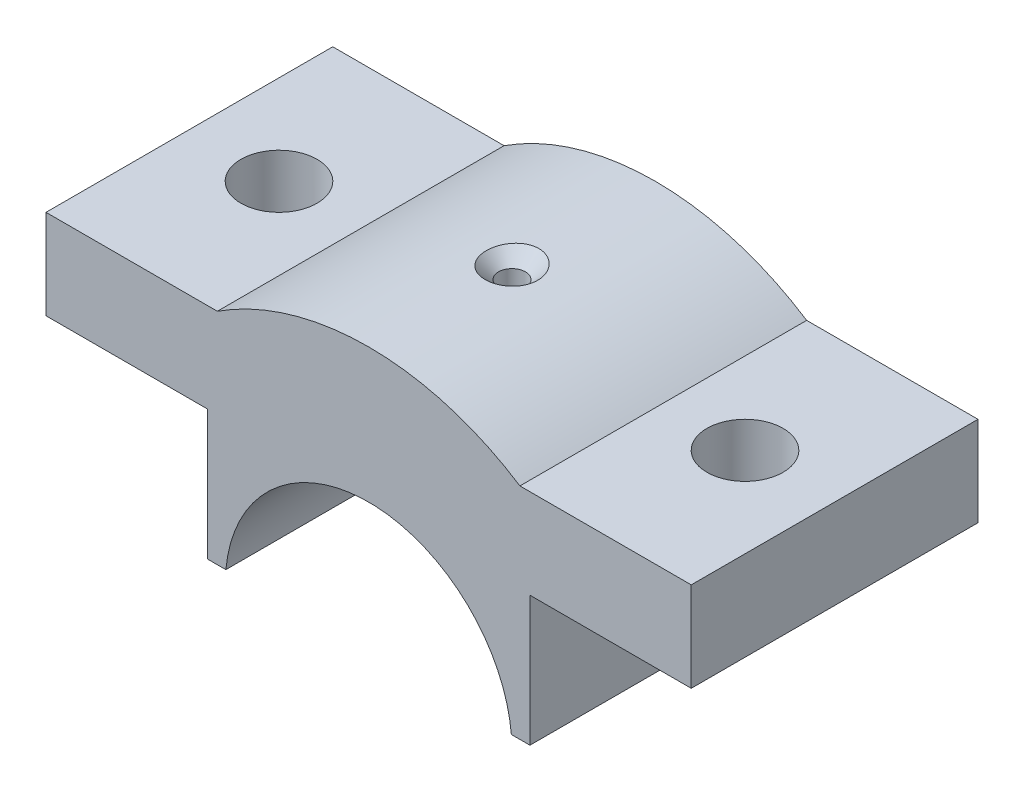
ISO-10303-21;
HEADER;
FILE_DESCRIPTION(('STEP AP214'),'2;1');
FILE_NAME('part.step','',(''),(''),'','','');
FILE_SCHEMA(('AUTOMOTIVE_DESIGN { 1 0 10303 214 1 1 1 1 }'));
ENDSEC;
DATA;
#1=APPLICATION_CONTEXT('core data for automotive mechanical design processes');
#2=APPLICATION_PROTOCOL_DEFINITION('international standard','automotive_design',2000,#1);
#3=PRODUCT_CONTEXT('',#1,'mechanical');
#4=PRODUCT('Part','Part','',(#3));
#5=PRODUCT_RELATED_PRODUCT_CATEGORY('part','',(#4));
#6=PRODUCT_DEFINITION_FORMATION('','',#4);
#7=PRODUCT_DEFINITION_CONTEXT('part definition',#1,'design');
#8=PRODUCT_DEFINITION('design','',#6,#7);
#9=PRODUCT_DEFINITION_SHAPE('','',#8);
#10=(LENGTH_UNIT() NAMED_UNIT(*) SI_UNIT(.MILLI.,.METRE.));
#11=(NAMED_UNIT(*) PLANE_ANGLE_UNIT() SI_UNIT($,.RADIAN.));
#12=(NAMED_UNIT(*) SI_UNIT($,.STERADIAN.) SOLID_ANGLE_UNIT());
#13=UNCERTAINTY_MEASURE_WITH_UNIT(LENGTH_MEASURE(1.E-05),#10,'distance_accuracy_value','');
#14=(GEOMETRIC_REPRESENTATION_CONTEXT(3) GLOBAL_UNCERTAINTY_ASSIGNED_CONTEXT((#13)) GLOBAL_UNIT_ASSIGNED_CONTEXT((#10,
#11,#12)) REPRESENTATION_CONTEXT('',''));
#15=CARTESIAN_POINT('',(0.,0.,0.));
#16=DIRECTION('',(0.,0.,1.));
#17=DIRECTION('',(1.,0.,0.));
#18=AXIS2_PLACEMENT_3D('',#15,#16,#17);
#19=CARTESIAN_POINT('',(0.,2.99999999999999,32.));
#20=DIRECTION('',(0.,1.,0.));
#21=DIRECTION('',(0.,0.,1.));
#22=AXIS2_PLACEMENT_3D('',#19,#20,#21);
#23=CYLINDRICAL_SURFACE('',#22,3.);
#24=CARTESIAN_POINT('',(0.,32.0048001568105,35.));
#25=CARTESIAN_POINT('',(0.168115517663945,32.0047983319346,34.9999926939908));
#26=CARTESIAN_POINT('',(0.336343494801439,32.0034614419944,34.985821025816));
#27=CARTESIAN_POINT('',(0.668139248437377,31.9982568701246,34.9294992968175));
#28=CARTESIAN_POINT('',(0.831701620944194,31.9943863686652,34.8873180647939));
#29=CARTESIAN_POINT('',(1.14931312039009,31.984551672751,34.7762126906234));
#30=CARTESIAN_POINT('',(1.3033677874041,31.9785887113646,34.7073042960471));
#31=CARTESIAN_POINT('',(1.5976893799492,31.9652366325189,34.5447302916791));
#32=CARTESIAN_POINT('',(1.73795912134394,31.9578478072402,34.4510697525192));
#33=CARTESIAN_POINT('',(2.00121039990366,31.9424459629027,34.2413295812445));
#34=CARTESIAN_POINT('',(2.12414194780613,31.9344312384766,34.125187325561));
#35=CARTESIAN_POINT('',(2.348797878852,31.9186950878854,33.8739137368302));
#36=CARTESIAN_POINT('',(2.45052130105543,31.9109736750232,33.7387815438133));
#37=CARTESIAN_POINT('',(2.63004768290318,31.8966806561919,33.4530547446494));
#38=CARTESIAN_POINT('',(2.70780587421977,31.8901112119074,33.3024318924965));
#39=CARTESIAN_POINT('',(2.83690863228271,31.8788865329611,32.9901956484371));
#40=CARTESIAN_POINT('',(2.88825377743868,31.8742312563822,32.8285824972908));
#41=CARTESIAN_POINT('',(2.96292588300417,31.8673770447499,32.4994599836979));
#42=CARTESIAN_POINT('',(2.9863352440661,31.8651708870142,32.3319694694281));
#43=CARTESIAN_POINT('',(3.00472593050557,31.8634421401491,31.9954232650604));
#44=CARTESIAN_POINT('',(2.99970791810621,31.8639194885067,31.8263676115145));
#45=CARTESIAN_POINT('',(2.96145428763413,31.8674972345695,31.4920566874133));
#46=CARTESIAN_POINT('',(2.92830847307408,31.8705892842186,31.3267910391936));
#47=CARTESIAN_POINT('',(2.83487977412146,31.8790349780355,31.0041789348896));
#48=CARTESIAN_POINT('',(2.77459656329884,31.8843886494078,30.84683257409));
#49=CARTESIAN_POINT('',(2.62850460075802,31.8967639746142,30.5442408492119));
#50=CARTESIAN_POINT('',(2.54265582854978,31.9037882401094,30.3990149182643));
#51=CARTESIAN_POINT('',(2.34789846752403,31.9187110137587,30.1249990810111));
#52=CARTESIAN_POINT('',(2.23898928622894,31.9266095443724,29.9962095971338));
#53=CARTESIAN_POINT('',(2.00070022736516,31.9424280645309,29.7582005446516));
#54=CARTESIAN_POINT('',(1.87124276160559,31.9503480188309,29.6490586380951));
#55=CARTESIAN_POINT('',(1.59580187450345,31.9652880478907,29.4540442329845));
#56=CARTESIAN_POINT('',(1.44981843786998,31.9723081218179,29.3681717559609));
#57=CARTESIAN_POINT('',(1.14541705514495,31.9846593253484,29.2221376118398));
#58=CARTESIAN_POINT('',(0.986997303495879,31.98999020914,29.1619796862928));
#59=CARTESIAN_POINT('',(0.662244741083313,31.9983597695283,29.0691382141594));
#60=CARTESIAN_POINT('',(0.495912138294615,32.0013985063345,29.0364539458993));
#61=CARTESIAN_POINT('',(0.160728240835851,32.0048336602874,28.9995856404269));
#62=CARTESIAN_POINT('',(-0.00811116390025835,32.0052400168862,28.9952943943303));
#63=CARTESIAN_POINT('',(-0.344106849833346,32.0033912353161,29.0150526548875));
#64=CARTESIAN_POINT('',(-0.511263150942916,32.0011361286721,29.039101825851));
#65=CARTESIAN_POINT('',(-0.838839728289025,31.9942242855993,29.1147693435582));
#66=CARTESIAN_POINT('',(-0.999271653193735,31.9895719051136,29.1663376928835));
#67=CARTESIAN_POINT('',(-1.30920699417556,31.9783877203985,29.2955284756984));
#68=CARTESIAN_POINT('',(-1.4587101935324,31.9718558789115,29.3731514256887));
#69=CARTESIAN_POINT('',(-1.743030220706,31.9576192556579,29.552515261775));
#70=CARTESIAN_POINT('',(-1.87780229220848,31.9499110610555,29.6543268185227));
#71=CARTESIAN_POINT('',(-2.12838183348266,31.9341982391321,29.8790761825181));
#72=CARTESIAN_POINT('',(-2.24418888567343,31.9261936052887,30.002014454822));
#73=CARTESIAN_POINT('',(-2.45392151261387,31.91076035801,30.2659942589946));
#74=CARTESIAN_POINT('',(-2.54777688418517,31.9033336419957,30.4070916939287));
#75=CARTESIAN_POINT('',(-2.71045983080749,31.8899252416078,30.7031078546338));
#76=CARTESIAN_POINT('',(-2.77928771188468,31.8839435395654,30.8580264113768));
#77=CARTESIAN_POINT('',(-2.88984355969819,31.8741138561404,31.1770433869726));
#78=CARTESIAN_POINT('',(-2.93161377453464,31.8702625497177,31.3411270580022));
#79=CARTESIAN_POINT('',(-2.98700585804465,31.8651190997703,31.6740167875639));
#80=CARTESIAN_POINT('',(-3.00062842757631,31.8638268925257,31.8428227284085));
#81=CARTESIAN_POINT('',(-2.9993294563224,31.8639491373506,32.1796675019656));
#82=CARTESIAN_POINT('',(-2.98451820308444,31.8653531315492,32.3477067747062));
#83=CARTESIAN_POINT('',(-2.9270027616158,31.8706873183879,32.678899227571));
#84=CARTESIAN_POINT('',(-2.88429853720601,31.8746175143046,32.8420524013573));
#85=CARTESIAN_POINT('',(-2.77223884072984,31.8845584308578,33.1588436209492));
#86=CARTESIAN_POINT('',(-2.70288612389382,31.8905689364013,33.3124826485314));
#87=CARTESIAN_POINT('',(-2.53950979661607,31.9039936639257,33.6059561486016));
#88=CARTESIAN_POINT('',(-2.44548642274569,31.911407872446,33.745790753445));
#89=CARTESIAN_POINT('',(-2.2350231729517,31.9268389875304,34.0082511111749));
#90=CARTESIAN_POINT('',(-2.11850125609184,31.9348580323374,34.1308109518064));
#91=CARTESIAN_POINT('',(-1.8665067362214,31.9505757033337,34.3546891653375));
#92=CARTESIAN_POINT('',(-1.73102958290196,31.9582742520086,34.456002423242));
#93=CARTESIAN_POINT('',(-1.44464228122472,31.9725011269799,34.6346859786519));
#94=CARTESIAN_POINT('',(-1.29369803748515,31.9790267766691,34.7120017977791));
#95=CARTESIAN_POINT('',(-0.981007628996828,31.9901427245557,34.8400891810584));
#96=CARTESIAN_POINT('',(-0.819273975005217,31.9947352206421,34.8908909061277));
#97=CARTESIAN_POINT('',(-0.547174299541794,32.0003035023116,34.9517327403566));
#98=CARTESIAN_POINT('',(-0.438552002040391,32.0019819589622,34.9698085005286));
#99=CARTESIAN_POINT('',(-0.219969184624212,32.0042308813294,34.9939444996144));
#100=CARTESIAN_POINT('',(-0.110008669417268,32.0048013509429,35.0000047807862));
#101=CARTESIAN_POINT('',(0.,32.0048001568105,35.));
#102=B_SPLINE_CURVE_WITH_KNOTS('',3,(#24,#25,#26,#27,#28,#29,#30,#31,#32,#33,#34,#35,#36,#37,
#38,#39,#40,#41,#42,#43,#44,#45,#46,#47,#48,#49,#50,#51,#52,#53,#54,#55,#56,#57,#58,#59,#60,#61,
#62,#63,#64,#65,#66,#67,#68,#69,#70,#71,#72,#73,#74,#75,#76,#77,#78,#79,#80,#81,#82,#83,#84,#85,
#86,#87,#88,#89,#90,#91,#92,#93,#94,#95,#96,#97,#98,#99,#100,#101),.UNSPECIFIED.,.T.,.F.,(4,2,2,
2,2,2,2,2,2,2,2,2,2,2,2,2,2,2,2,2,2,2,2,2,2,2,2,2,2,2,2,2,2,2,2,2,2,2,4),(0.,0.503944865997051,
1.00845150268335,1.51266133589671,2.01676795852594,2.52229953677205,3.02785401567332,
3.53434725183142,4.04082939600767,4.54581387551178,5.05078659131899,5.55415312239402,
6.05752570852099,6.56169045684706,7.06586815995459,7.57199697216073,8.07812625267417,
8.584329151591,9.0905187532349,9.5947959432735,10.0990671602439,10.6024253104018,
11.1057934396133,11.6106507227919,12.1155191206673,12.6219806991962,13.1284360847067,
13.6340987675239,14.1397488595171,14.6434416257731,15.1471350453547,15.6507764012726,
16.1544129278599,16.6599218849808,17.1655524011808,17.6723225302686,18.1785149232206,
18.5082792419098,18.8380424008278),.UNSPECIFIED.);
#103=CARTESIAN_POINT('',(0.,32.0048001568105,35.));
#104=VERTEX_POINT('',#103);
#105=EDGE_CURVE('E321',#104,#104,#102,.T.);
#106=ORIENTED_EDGE('',*,*,#105,.F.);
#107=EDGE_LOOP('',(#106));
#108=FACE_BOUND('',#107,.T.);
#109=CARTESIAN_POINT('',(0.,59.,32.));
#110=DIRECTION('',(0.,1.,0.));
#111=DIRECTION('',(0.,0.,1.));
#112=AXIS2_PLACEMENT_3D('',#109,#110,#111);
#113=CIRCLE('',#112,2.99999999999999);
#114=CARTESIAN_POINT('',(0.,59.,35.));
#115=VERTEX_POINT('',#114);
#116=EDGE_CURVE('E453',#115,#115,#113,.T.);
#117=ORIENTED_EDGE('',*,*,#116,.T.);
#118=EDGE_LOOP('',(#117));
#119=FACE_BOUND('',#118,.T.);
#120=ADVANCED_FACE('F40',(#108,#119),#23,.F.);
#121=CARTESIAN_POINT('',(-36.0038860322683,2.99999999999999,64.));
#122=DIRECTION('',(0.,1.,0.));
#123=DIRECTION('',(0.,0.,1.));
#124=AXIS2_PLACEMENT_3D('',#121,#122,#123);
#125=PLANE('',#124);
#126=DIRECTION('',(1.,0.,0.));
#127=VECTOR('',#126,1.);
#128=CARTESIAN_POINT('',(-36.0038860322683,2.99999999999999,0.));
#129=LINE('',#128,#127);
#130=CARTESIAN_POINT('',(-36.0038860322683,2.99999999999999,0.));
#131=VERTEX_POINT('',#130);
#132=CARTESIAN_POINT('',(-31.8638860322683,2.99999999999999,0.));
#133=VERTEX_POINT('',#132);
#134=EDGE_CURVE('E168',#131,#133,#129,.T.);
#135=ORIENTED_EDGE('',*,*,#134,.T.);
#136=DIRECTION('',(0.,0.,-1.));
#137=VECTOR('',#136,1.);
#138=CARTESIAN_POINT('',(-31.8638860322683,2.99999999999999,64.));
#139=LINE('',#138,#137);
#140=CARTESIAN_POINT('',(-31.8638860322683,2.99999999999999,64.));
#141=VERTEX_POINT('',#140);
#142=EDGE_CURVE('E11',#141,#133,#139,.T.);
#143=ORIENTED_EDGE('',*,*,#142,.F.);
#144=DIRECTION('',(1.,0.,0.));
#145=VECTOR('',#144,1.);
#146=CARTESIAN_POINT('',(-36.0038860322683,2.99999999999999,64.));
#147=LINE('',#146,#145);
#148=CARTESIAN_POINT('',(-36.0038860322683,2.99999999999999,64.));
#149=VERTEX_POINT('',#148);
#150=EDGE_CURVE('E202',#149,#141,#147,.T.);
#151=ORIENTED_EDGE('',*,*,#150,.F.);
#152=DIRECTION('',(0.,0.,-1.));
#153=VECTOR('',#152,1.);
#154=CARTESIAN_POINT('',(-36.0038860322683,2.99999999999999,64.));
#155=LINE('',#154,#153);
#156=EDGE_CURVE('E164',#149,#131,#155,.T.);
#157=ORIENTED_EDGE('',*,*,#156,.T.);
#158=EDGE_LOOP('',(#135,#143,#151,#157));
#159=FACE_BOUND('',#158,.T.);
#160=ADVANCED_FACE('F42',(#159),#125,.F.);
#161=CARTESIAN_POINT('',(0.,0.,64.));
#162=DIRECTION('',(0.,0.,-1.));
#163=DIRECTION('',(-1.,0.,0.));
#164=AXIS2_PLACEMENT_3D('',#161,#162,#163);
#165=CYLINDRICAL_SURFACE('',#164,32.0048001568105);
#166=ORIENTED_EDGE('',*,*,#105,.T.);
#167=EDGE_LOOP('',(#166));
#168=FACE_BOUND('',#167,.T.);
#169=CARTESIAN_POINT('',(0.,0.,0.));
#170=DIRECTION('',(0.,0.,-1.));
#171=DIRECTION('',(1.,0.,0.));
#172=AXIS2_PLACEMENT_3D('',#169,#170,#171);
#173=CIRCLE('',#172,32.0048001568105);
#174=CARTESIAN_POINT('',(31.8638860322683,2.99999999999999,0.));
#175=VERTEX_POINT('',#174);
#176=EDGE_CURVE('E172',#133,#175,#173,.T.);
#177=ORIENTED_EDGE('',*,*,#176,.T.);
#178=DIRECTION('',(0.,0.,-1.));
#179=VECTOR('',#178,1.);
#180=CARTESIAN_POINT('',(31.8638860322683,2.99999999999999,64.));
#181=LINE('',#180,#179);
#182=CARTESIAN_POINT('',(31.8638860322683,2.99999999999999,64.));
#183=VERTEX_POINT('',#182);
#184=EDGE_CURVE('E51',#183,#175,#181,.T.);
#185=ORIENTED_EDGE('',*,*,#184,.F.);
#186=CARTESIAN_POINT('',(0.,0.,64.));
#187=DIRECTION('',(0.,0.,-1.));
#188=DIRECTION('',(1.,0.,0.));
#189=AXIS2_PLACEMENT_3D('',#186,#187,#188);
#190=CIRCLE('',#189,32.0048001568105);
#191=EDGE_CURVE('E114',#141,#183,#190,.T.);
#192=ORIENTED_EDGE('',*,*,#191,.F.);
#193=ORIENTED_EDGE('',*,*,#142,.T.);
#194=EDGE_LOOP('',(#177,#185,#192,#193));
#195=FACE_BOUND('',#194,.T.);
#196=ADVANCED_FACE('F310',(#168,#195),#165,.F.);
#197=CARTESIAN_POINT('',(36.0038860322683,2.99999999999999,64.));
#198=DIRECTION('',(0.,1.,0.));
#199=DIRECTION('',(0.,0.,1.));
#200=AXIS2_PLACEMENT_3D('',#197,#198,#199);
#201=PLANE('',#200);
#202=DIRECTION('',(1.,0.,0.));
#203=VECTOR('',#202,1.);
#204=CARTESIAN_POINT('',(36.0038860322683,2.99999999999999,0.));
#205=LINE('',#204,#203);
#206=CARTESIAN_POINT('',(36.0038860322683,2.99999999999999,0.));
#207=VERTEX_POINT('',#206);
#208=EDGE_CURVE('E175',#175,#207,#205,.T.);
#209=ORIENTED_EDGE('',*,*,#208,.T.);
#210=DIRECTION('',(0.,0.,-1.));
#211=VECTOR('',#210,1.);
#212=CARTESIAN_POINT('',(36.0038860322683,2.99999999999999,64.));
#213=LINE('',#212,#211);
#214=CARTESIAN_POINT('',(36.0038860322683,2.99999999999999,64.));
#215=VERTEX_POINT('',#214);
#216=EDGE_CURVE('E229',#215,#207,#213,.T.);
#217=ORIENTED_EDGE('',*,*,#216,.F.);
#218=DIRECTION('',(1.,0.,0.));
#219=VECTOR('',#218,1.);
#220=CARTESIAN_POINT('',(36.0038860322683,2.99999999999999,64.));
#221=LINE('',#220,#219);
#222=EDGE_CURVE('E241',#183,#215,#221,.T.);
#223=ORIENTED_EDGE('',*,*,#222,.F.);
#224=ORIENTED_EDGE('',*,*,#184,.T.);
#225=EDGE_LOOP('',(#209,#217,#223,#224));
#226=FACE_BOUND('',#225,.T.);
#227=ADVANCED_FACE('F239',(#226),#201,.F.);
#228=CARTESIAN_POINT('',(36.0038860322683,32.,64.));
#229=DIRECTION('',(-1.,0.,0.));
#230=DIRECTION('',(0.,-1.,0.));
#231=AXIS2_PLACEMENT_3D('',#228,#229,#230);
#232=PLANE('',#231);
#233=DIRECTION('',(0.,1.,0.));
#234=VECTOR('',#233,1.);
#235=CARTESIAN_POINT('',(36.0038860322683,32.,0.));
#236=LINE('',#235,#234);
#237=CARTESIAN_POINT('',(36.0038860322683,32.,0.));
#238=VERTEX_POINT('',#237);
#239=EDGE_CURVE('E178',#207,#238,#236,.T.);
#240=ORIENTED_EDGE('',*,*,#239,.T.);
#241=DIRECTION('',(0.,0.,-1.));
#242=VECTOR('',#241,1.);
#243=CARTESIAN_POINT('',(36.0038860322683,32.,64.));
#244=LINE('',#243,#242);
#245=CARTESIAN_POINT('',(36.0038860322683,32.,64.));
#246=VERTEX_POINT('',#245);
#247=EDGE_CURVE('E225',#246,#238,#244,.T.);
#248=ORIENTED_EDGE('',*,*,#247,.F.);
#249=DIRECTION('',(0.,1.,0.));
#250=VECTOR('',#249,1.);
#251=CARTESIAN_POINT('',(36.0038860322683,32.,64.));
#252=LINE('',#251,#250);
#253=EDGE_CURVE('E260',#215,#246,#252,.T.);
#254=ORIENTED_EDGE('',*,*,#253,.F.);
#255=ORIENTED_EDGE('',*,*,#216,.T.);
#256=EDGE_LOOP('',(#240,#248,#254,#255));
#257=FACE_BOUND('',#256,.T.);
#258=ADVANCED_FACE('F250',(#257),#232,.F.);
#259=CARTESIAN_POINT('',(72.0038860322683,32.,64.));
#260=DIRECTION('',(0.,1.,0.));
#261=DIRECTION('',(0.,0.,1.));
#262=AXIS2_PLACEMENT_3D('',#259,#260,#261);
#263=PLANE('',#262);
#264=CARTESIAN_POINT('',(52.0038860322682,32.,32.));
#265=DIRECTION('',(0.,1.,0.));
#266=DIRECTION('',(0.,0.,1.));
#267=AXIS2_PLACEMENT_3D('',#264,#265,#266);
#268=CIRCLE('',#267,8.5);
#269=CARTESIAN_POINT('',(52.0038860322682,32.,40.5));
#270=VERTEX_POINT('',#269);
#271=EDGE_CURVE('E465',#270,#270,#268,.F.);
#272=ORIENTED_EDGE('',*,*,#271,.F.);
#273=EDGE_LOOP('',(#272));
#274=FACE_BOUND('',#273,.T.);
#275=DIRECTION('',(1.,0.,0.));
#276=VECTOR('',#275,1.);
#277=CARTESIAN_POINT('',(72.0038860322683,32.,0.));
#278=LINE('',#277,#276);
#279=CARTESIAN_POINT('',(72.0038860322683,32.,0.));
#280=VERTEX_POINT('',#279);
#281=EDGE_CURVE('E181',#238,#280,#278,.T.);
#282=ORIENTED_EDGE('',*,*,#281,.T.);
#283=DIRECTION('',(0.,0.,-1.));
#284=VECTOR('',#283,1.);
#285=CARTESIAN_POINT('',(72.0038860322683,32.,64.));
#286=LINE('',#285,#284);
#287=CARTESIAN_POINT('',(72.0038860322683,32.,64.));
#288=VERTEX_POINT('',#287);
#289=EDGE_CURVE('E221',#288,#280,#286,.T.);
#290=ORIENTED_EDGE('',*,*,#289,.F.);
#291=DIRECTION('',(1.,0.,0.));
#292=VECTOR('',#291,1.);
#293=CARTESIAN_POINT('',(72.0038860322683,32.,64.));
#294=LINE('',#293,#292);
#295=EDGE_CURVE('E256',#246,#288,#294,.T.);
#296=ORIENTED_EDGE('',*,*,#295,.F.);
#297=ORIENTED_EDGE('',*,*,#247,.T.);
#298=EDGE_LOOP('',(#282,#290,#296,#297));
#299=FACE_BOUND('',#298,.T.);
#300=ADVANCED_FACE('F254',(#274,#299),#263,.F.);
#301=CARTESIAN_POINT('',(72.0038860322683,52.,64.));
#302=DIRECTION('',(-1.,0.,0.));
#303=DIRECTION('',(0.,0.,1.));
#304=AXIS2_PLACEMENT_3D('',#301,#302,#303);
#305=PLANE('',#304);
#306=DIRECTION('',(0.,1.,0.));
#307=VECTOR('',#306,1.);
#308=CARTESIAN_POINT('',(72.0038860322683,52.,0.));
#309=LINE('',#308,#307);
#310=CARTESIAN_POINT('',(72.0038860322683,52.,0.));
#311=VERTEX_POINT('',#310);
#312=EDGE_CURVE('E184',#280,#311,#309,.T.);
#313=ORIENTED_EDGE('',*,*,#312,.T.);
#314=DIRECTION('',(0.,0.,-1.));
#315=VECTOR('',#314,1.);
#316=CARTESIAN_POINT('',(72.0038860322683,52.,64.));
#317=LINE('',#316,#315);
#318=CARTESIAN_POINT('',(72.0038860322683,52.,64.));
#319=VERTEX_POINT('',#318);
#320=EDGE_CURVE('E217',#319,#311,#317,.T.);
#321=ORIENTED_EDGE('',*,*,#320,.F.);
#322=DIRECTION('',(0.,1.,0.));
#323=VECTOR('',#322,1.);
#324=CARTESIAN_POINT('',(72.0038860322683,52.,64.));
#325=LINE('',#324,#323);
#326=EDGE_CURVE('E259',#288,#319,#325,.T.);
#327=ORIENTED_EDGE('',*,*,#326,.F.);
#328=ORIENTED_EDGE('',*,*,#289,.T.);
#329=EDGE_LOOP('',(#313,#321,#327,#328));
#330=FACE_BOUND('',#329,.T.);
#331=ADVANCED_FACE('F347',(#330),#305,.F.);
#332=CARTESIAN_POINT('',(33.7638860322683,52.,64.));
#333=DIRECTION('',(0.,-1.,0.));
#334=DIRECTION('',(1.,0.,0.));
#335=AXIS2_PLACEMENT_3D('',#332,#333,#334);
#336=PLANE('',#335);
#337=CARTESIAN_POINT('',(52.0038860322682,52.,32.));
#338=DIRECTION('',(0.,-1.,0.));
#339=DIRECTION('',(1.,0.,0.));
#340=AXIS2_PLACEMENT_3D('',#337,#338,#339);
#341=CIRCLE('',#340,8.5);
#342=CARTESIAN_POINT('',(60.5038860322682,52.,32.));
#343=VERTEX_POINT('',#342);
#344=EDGE_CURVE('E329',#343,#343,#341,.T.);
#345=ORIENTED_EDGE('',*,*,#344,.T.);
#346=EDGE_LOOP('',(#345));
#347=FACE_BOUND('',#346,.T.);
#348=DIRECTION('',(-1.,0.,0.));
#349=VECTOR('',#348,1.);
#350=CARTESIAN_POINT('',(33.7638860322683,52.,0.));
#351=LINE('',#350,#349);
#352=CARTESIAN_POINT('',(33.7638860322683,52.,0.));
#353=VERTEX_POINT('',#352);
#354=EDGE_CURVE('E187',#311,#353,#351,.T.);
#355=ORIENTED_EDGE('',*,*,#354,.T.);
#356=DIRECTION('',(0.,0.,-1.));
#357=VECTOR('',#356,1.);
#358=CARTESIAN_POINT('',(33.7638860322683,52.,64.));
#359=LINE('',#358,#357);
#360=CARTESIAN_POINT('',(33.7638860322683,52.,64.));
#361=VERTEX_POINT('',#360);
#362=EDGE_CURVE('E213',#361,#353,#359,.T.);
#363=ORIENTED_EDGE('',*,*,#362,.F.);
#364=DIRECTION('',(-1.,0.,0.));
#365=VECTOR('',#364,1.);
#366=CARTESIAN_POINT('',(33.7638860322683,52.,64.));
#367=LINE('',#366,#365);
#368=EDGE_CURVE('E265',#319,#361,#367,.T.);
#369=ORIENTED_EDGE('',*,*,#368,.F.);
#370=ORIENTED_EDGE('',*,*,#320,.T.);
#371=EDGE_LOOP('',(#355,#363,#369,#370));
#372=FACE_BOUND('',#371,.T.);
#373=ADVANCED_FACE('F351',(#347,#372),#336,.F.);
#374=CARTESIAN_POINT('',(0.,0.,64.));
#375=DIRECTION('',(0.,0.,-1.));
#376=DIRECTION('',(-1.,0.,0.));
#377=AXIS2_PLACEMENT_3D('',#374,#375,#376);
#378=CYLINDRICAL_SURFACE('',#377,62.);
#379=CARTESIAN_POINT('',(-4.1432200047347,61.8614074305587,27.8539386297428));
#380=CARTESIAN_POINT('',(-3.94751924818843,61.8745139471167,27.6398450870621));
#381=CARTESIAN_POINT('',(-3.73598444698998,61.8877482386713,27.4401805150375));
#382=CARTESIAN_POINT('',(-3.28522993104094,61.9133121309928,27.0746956293416));
#383=CARTESIAN_POINT('',(-3.04599682429934,61.9256412893853,26.9088917951442));
#384=CARTESIAN_POINT('',(-2.51402060056165,61.9496472148655,26.597780461963));
#385=CARTESIAN_POINT('',(-2.21831291256616,61.9610587529829,26.4574767929527));
#386=CARTESIAN_POINT('',(-1.60674302272517,61.9799310250227,26.2307512869719));
#387=CARTESIAN_POINT('',(-1.29088004694282,61.9873916071311,26.1443315204473));
#388=CARTESIAN_POINT('',(-0.661709108467144,61.9972347063144,26.0311670226696));
#389=CARTESIAN_POINT('',(-0.348810468510347,61.9998096158395,26.0021593530094));
#390=CARTESIAN_POINT('',(0.2772959011695,62.0001697619279,25.9980743682029));
#391=CARTESIAN_POINT('',(0.590503553979537,61.997955984643,26.0229859492691));
#392=CARTESIAN_POINT('',(1.20181089843384,61.9890902864251,26.1247178442654));
#393=CARTESIAN_POINT('',(1.50008747569454,61.9825280304734,26.2004898249257));
#394=CARTESIAN_POINT('',(2.07994096532294,61.9657813423992,26.4001464545454));
#395=CARTESIAN_POINT('',(2.36151692539217,61.9555967039533,26.5240338440952));
#396=CARTESIAN_POINT('',(2.90494509531615,61.9325157140854,26.8180293271971));
#397=CARTESIAN_POINT('',(3.16642132669146,61.9195795583236,26.9888279633169));
#398=CARTESIAN_POINT('',(3.65836502417667,61.8924646512143,27.3702862014805));
#399=CARTESIAN_POINT('',(3.88882707208199,61.8782856834592,27.5809527530547));
#400=CARTESIAN_POINT('',(4.32220949806977,61.8495566167043,28.045199920184));
#401=CARTESIAN_POINT('',(4.52364099049161,61.8350146672064,28.3001704511577));
#402=CARTESIAN_POINT('',(4.88296386918508,61.807679355137,28.8392093776688));
#403=CARTESIAN_POINT('',(5.04084617743112,61.7948863574225,29.1232838231499));
#404=CARTESIAN_POINT('',(5.31562596132362,61.7718710157608,29.7256432006006));
#405=CARTESIAN_POINT('',(5.43045950217344,61.7617835143241,30.0448756520254));
#406=CARTESIAN_POINT('',(5.60675063435833,61.7460299732894,30.6978611283449));
#407=CARTESIAN_POINT('',(5.66819949043017,61.7403646573029,31.0316165202299));
#408=CARTESIAN_POINT('',(5.73740772502607,61.7339732775288,31.7143316948689));
#409=CARTESIAN_POINT('',(5.74358831654049,61.7333924667766,32.0634537949303));
#410=CARTESIAN_POINT('',(5.69798050318832,61.7376183132577,32.7578812543156));
#411=CARTESIAN_POINT('',(5.64618717408122,61.7424254281354,33.1031862869061));
#412=CARTESIAN_POINT('',(5.48515213259931,61.7569400965812,33.7827622886887));
#413=CARTESIAN_POINT('',(5.37548847270736,61.766683621674,34.1169327921183));
#414=CARTESIAN_POINT('',(5.10093007185615,61.7899619081231,34.7616643813521));
#415=CARTESIAN_POINT('',(4.93603662882738,61.803496580384,35.0722260217672));
#416=CARTESIAN_POINT('',(4.55779033679776,61.8325307798886,35.6556569304758));
#417=CARTESIAN_POINT('',(4.34519593328925,61.8479980351739,35.9290187566806));
#418=CARTESIAN_POINT('',(3.87550947676467,61.8792018956438,36.4344267534496));
#419=CARTESIAN_POINT('',(3.61842621769734,61.8949384470446,36.6664810707623));
#420=CARTESIAN_POINT('',(3.07690692673736,61.9241740729683,37.073338819972));
#421=CARTESIAN_POINT('',(2.79381568529567,61.9377339426391,37.2499261734903));
#422=CARTESIAN_POINT('',(2.20082185488086,61.9616348856661,37.5504707824217));
#423=CARTESIAN_POINT('',(1.8909277614255,61.971976974197,37.6744446413178));
#424=CARTESIAN_POINT('',(1.26852632014799,61.9877667571959,37.8604394342634));
#425=CARTESIAN_POINT('',(0.956797704501669,61.9934180625552,37.9250523947919));
#426=CARTESIAN_POINT('',(0.326833397419137,61.9999377725314,37.9994130189334));
#427=CARTESIAN_POINT('',(0.008599103334095,62.0008071936348,38.009172342808));
#428=CARTESIAN_POINT('',(-0.615132571404732,61.99770974303,37.974008161832));
#429=CARTESIAN_POINT('',(-0.920724749322324,61.9938878496418,37.9307239573618));
#430=CARTESIAN_POINT('',(-1.52030824748652,61.9820830395573,37.7938330341689));
#431=CARTESIAN_POINT('',(-1.81429968990281,61.9741001666938,37.700226845549));
#432=CARTESIAN_POINT('',(-2.38398280667024,61.9548085934674,37.4654925737885));
#433=CARTESIAN_POINT('',(-2.65958944942818,61.9434855979604,37.3241598450255));
#434=CARTESIAN_POINT('',(-3.18416870293178,61.9187382264403,36.9987682631532));
#435=CARTESIAN_POINT('',(-3.43313746037365,61.905313547098,36.8147032407773));
#436=CARTESIAN_POINT('',(-3.90674829145964,61.8772625652744,36.4024161469104));
#437=CARTESIAN_POINT('',(-4.13024823932966,61.8626107426405,36.1728848082755));
#438=CARTESIAN_POINT('',(-4.53752434721178,61.8340736044921,35.6809131981341));
#439=CARTESIAN_POINT('',(-4.72129214766896,61.8201884507398,35.4184660195262));
#440=CARTESIAN_POINT('',(-5.05250359383792,61.7940218116654,34.8555276578124));
#441=CARTESIAN_POINT('',(-5.19795748532591,61.7818396937032,34.5538606105312));
#442=CARTESIAN_POINT('',(-5.43820286823593,61.7611572467989,33.9308769867234));
#443=CARTESIAN_POINT('',(-5.53298622315763,61.7526575092023,33.6095572636638));
#444=CARTESIAN_POINT('',(-5.67229310015084,61.7400213283591,32.9445592319272));
#445=CARTESIAN_POINT('',(-5.7149793927866,61.7360447033011,32.600492043477));
#446=CARTESIAN_POINT('',(-5.74313373324665,61.7334318632545,31.9099355375315));
#447=CARTESIAN_POINT('',(-5.72858743520093,61.7347969872235,31.5634456344892));
#448=CARTESIAN_POINT('',(-5.64193954027306,61.742776346877,30.8726387968051));
#449=CARTESIAN_POINT('',(-5.56900004740949,61.7494669914548,30.5284275936309));
#450=CARTESIAN_POINT('',(-5.3661335304549,61.767425999359,29.8574780582084));
#451=CARTESIAN_POINT('',(-5.23624317756391,61.7786914166018,29.5307286337964));
#452=CARTESIAN_POINT('',(-4.95554677376983,61.8017625105026,28.9702129042832));
#453=CARTESIAN_POINT('',(-4.8148319832488,61.8129599671973,28.7313127094362));
#454=CARTESIAN_POINT('',(-4.50193861102971,61.8365357280973,28.275223506285));
#455=CARTESIAN_POINT('',(-4.32977352889927,61.8489135245741,28.0580252443927));
#456=CARTESIAN_POINT('',(-4.1432200047347,61.8614074305587,27.8539386297428));
#457=B_SPLINE_CURVE_WITH_KNOTS('',3,(#379,#380,#381,#382,#383,#384,#385,#386,#387,#388,#389,
#390,#391,#392,#393,#394,#395,#396,#397,#398,#399,#400,#401,#402,#403,#404,#405,#406,#407,#408,
#409,#410,#411,#412,#413,#414,#415,#416,#417,#418,#419,#420,#421,#422,#423,#424,#425,#426,#427,
#428,#429,#430,#431,#432,#433,#434,#435,#436,#437,#438,#439,#440,#441,#442,#443,#444,#445,#446,
#447,#448,#449,#450,#451,#452,#453,#454,#455,#456),.UNSPECIFIED.,.T.,.F.,(4,2,2,2,2,2,2,2,2,2,2,
2,2,2,2,2,2,2,2,2,2,2,2,2,2,2,2,2,2,2,2,2,2,2,2,2,2,2,4),(0.,0.870298868595537,1.74102029346421,
2.71847538570767,3.69596803356841,4.63409762121172,5.57203403479765,6.49120828111729,
7.41043489007418,8.34399381277606,9.27771561788635,10.2491608208084,11.2208083731296,
12.234408752898,13.2481749554941,14.2908108952985,15.3335354021637,16.383969920298,
17.4343797543714,18.4691425686128,19.5037010782316,20.5004104210638,21.4968049934238,
22.4472762849057,23.3975455266452,24.3191732057708,25.2407911764581,26.1664121996771,
27.092166938108,28.050005505408,29.0080454041102,30.0088893428384,31.0098939454043,
32.0452648443661,33.0808952850036,34.1316584254882,35.1817459609726,36.0117216854619,
36.8413419888181),.UNSPECIFIED.);
#458=CARTESIAN_POINT('',(-4.1432200047347,61.8614074305587,27.8539386297428));
#459=VERTEX_POINT('',#458);
#460=EDGE_CURVE('E330',#459,#459,#457,.T.);
#461=ORIENTED_EDGE('',*,*,#460,.T.);
#462=EDGE_LOOP('',(#461));
#463=FACE_BOUND('',#462,.T.);
#464=CARTESIAN_POINT('',(0.,0.,0.));
#465=DIRECTION('',(0.,0.,1.));
#466=DIRECTION('',(1.,0.,0.));
#467=AXIS2_PLACEMENT_3D('',#464,#465,#466);
#468=CIRCLE('',#467,62.);
#469=CARTESIAN_POINT('',(-33.7638860322683,52.,0.));
#470=VERTEX_POINT('',#469);
#471=EDGE_CURVE('E190',#353,#470,#468,.T.);
#472=ORIENTED_EDGE('',*,*,#471,.T.);
#473=DIRECTION('',(0.,0.,-1.));
#474=VECTOR('',#473,1.);
#475=CARTESIAN_POINT('',(-33.7638860322683,52.,64.));
#476=LINE('',#475,#474);
#477=CARTESIAN_POINT('',(-33.7638860322683,52.,64.));
#478=VERTEX_POINT('',#477);
#479=EDGE_CURVE('E209',#478,#470,#476,.T.);
#480=ORIENTED_EDGE('',*,*,#479,.F.);
#481=CARTESIAN_POINT('',(0.,0.,64.));
#482=DIRECTION('',(0.,0.,1.));
#483=DIRECTION('',(1.,0.,0.));
#484=AXIS2_PLACEMENT_3D('',#481,#482,#483);
#485=CIRCLE('',#484,62.);
#486=EDGE_CURVE('E272',#361,#478,#485,.T.);
#487=ORIENTED_EDGE('',*,*,#486,.F.);
#488=ORIENTED_EDGE('',*,*,#362,.T.);
#489=EDGE_LOOP('',(#472,#480,#487,#488));
#490=FACE_BOUND('',#489,.T.);
#491=ADVANCED_FACE('F285',(#463,#490),#378,.T.);
#492=CARTESIAN_POINT('',(-33.7638860322683,52.,64.));
#493=DIRECTION('',(0.,-1.,0.));
#494=DIRECTION('',(1.,0.,0.));
#495=AXIS2_PLACEMENT_3D('',#492,#493,#494);
#496=PLANE('',#495);
#497=CARTESIAN_POINT('',(-52.0038860322682,52.,32.));
#498=DIRECTION('',(0.,1.,0.));
#499=DIRECTION('',(-1.,0.,0.));
#500=AXIS2_PLACEMENT_3D('',#497,#498,#499);
#501=CIRCLE('',#500,8.5);
#502=CARTESIAN_POINT('',(-60.5038860322682,52.,32.));
#503=VERTEX_POINT('',#502);
#504=EDGE_CURVE('E469',#503,#503,#501,.T.);
#505=ORIENTED_EDGE('',*,*,#504,.F.);
#506=EDGE_LOOP('',(#505));
#507=FACE_BOUND('',#506,.T.);
#508=DIRECTION('',(-1.,0.,0.));
#509=VECTOR('',#508,1.);
#510=CARTESIAN_POINT('',(-33.7638860322683,52.,0.));
#511=LINE('',#510,#509);
#512=CARTESIAN_POINT('',(-72.0038860322683,52.,0.));
#513=VERTEX_POINT('',#512);
#514=EDGE_CURVE('E193',#470,#513,#511,.T.);
#515=ORIENTED_EDGE('',*,*,#514,.T.);
#516=DIRECTION('',(0.,0.,-1.));
#517=VECTOR('',#516,1.);
#518=CARTESIAN_POINT('',(-72.0038860322683,52.,64.));
#519=LINE('',#518,#517);
#520=CARTESIAN_POINT('',(-72.0038860322683,52.,64.));
#521=VERTEX_POINT('',#520);
#522=EDGE_CURVE('E156',#521,#513,#519,.T.);
#523=ORIENTED_EDGE('',*,*,#522,.F.);
#524=DIRECTION('',(-1.,0.,0.));
#525=VECTOR('',#524,1.);
#526=CARTESIAN_POINT('',(-33.7638860322683,52.,64.));
#527=LINE('',#526,#525);
#528=EDGE_CURVE('E145',#478,#521,#527,.T.);
#529=ORIENTED_EDGE('',*,*,#528,.F.);
#530=ORIENTED_EDGE('',*,*,#479,.T.);
#531=EDGE_LOOP('',(#515,#523,#529,#530));
#532=FACE_BOUND('',#531,.T.);
#533=ADVANCED_FACE('F289',(#507,#532),#496,.F.);
#534=CARTESIAN_POINT('',(-72.0038860322683,52.,64.));
#535=DIRECTION('',(1.,0.,0.));
#536=DIRECTION('',(0.,0.,-1.));
#537=AXIS2_PLACEMENT_3D('',#534,#535,#536);
#538=PLANE('',#537);
#539=DIRECTION('',(0.,-1.,0.));
#540=VECTOR('',#539,1.);
#541=CARTESIAN_POINT('',(-72.0038860322683,52.,0.));
#542=LINE('',#541,#540);
#543=CARTESIAN_POINT('',(-72.0038860322683,32.,0.));
#544=VERTEX_POINT('',#543);
#545=EDGE_CURVE('E154',#513,#544,#542,.T.);
#546=ORIENTED_EDGE('',*,*,#545,.T.);
#547=DIRECTION('',(0.,0.,-1.));
#548=VECTOR('',#547,1.);
#549=CARTESIAN_POINT('',(-72.0038860322683,32.,64.));
#550=LINE('',#549,#548);
#551=CARTESIAN_POINT('',(-72.0038860322683,32.,64.));
#552=VERTEX_POINT('',#551);
#553=EDGE_CURVE('E151',#552,#544,#550,.T.);
#554=ORIENTED_EDGE('',*,*,#553,.F.);
#555=DIRECTION('',(0.,-1.,0.));
#556=VECTOR('',#555,1.);
#557=CARTESIAN_POINT('',(-72.0038860322683,52.,64.));
#558=LINE('',#557,#556);
#559=EDGE_CURVE('E139',#521,#552,#558,.T.);
#560=ORIENTED_EDGE('',*,*,#559,.F.);
#561=ORIENTED_EDGE('',*,*,#522,.T.);
#562=EDGE_LOOP('',(#546,#554,#560,#561));
#563=FACE_BOUND('',#562,.T.);
#564=ADVANCED_FACE('F152',(#563),#538,.F.);
#565=CARTESIAN_POINT('',(-72.0038860322683,32.,64.));
#566=DIRECTION('',(0.,1.,0.));
#567=DIRECTION('',(0.,0.,1.));
#568=AXIS2_PLACEMENT_3D('',#565,#566,#567);
#569=PLANE('',#568);
#570=CARTESIAN_POINT('',(-52.0038860322682,32.,32.));
#571=DIRECTION('',(0.,1.,0.));
#572=DIRECTION('',(0.,0.,1.));
#573=AXIS2_PLACEMENT_3D('',#570,#571,#572);
#574=CIRCLE('',#573,8.5);
#575=CARTESIAN_POINT('',(-52.0038860322682,32.,40.5));
#576=VERTEX_POINT('',#575);
#577=EDGE_CURVE('E44',#576,#576,#574,.T.);
#578=ORIENTED_EDGE('',*,*,#577,.T.);
#579=EDGE_LOOP('',(#578));
#580=FACE_BOUND('',#579,.T.);
#581=DIRECTION('',(1.,0.,0.));
#582=VECTOR('',#581,1.);
#583=CARTESIAN_POINT('',(-72.0038860322683,32.,0.));
#584=LINE('',#583,#582);
#585=CARTESIAN_POINT('',(-36.0038860322683,32.,0.));
#586=VERTEX_POINT('',#585);
#587=EDGE_CURVE('E100',#544,#586,#584,.T.);
#588=ORIENTED_EDGE('',*,*,#587,.T.);
#589=DIRECTION('',(0.,0.,-1.));
#590=VECTOR('',#589,1.);
#591=CARTESIAN_POINT('',(-36.0038860322683,32.,64.));
#592=LINE('',#591,#590);
#593=CARTESIAN_POINT('',(-36.0038860322683,32.,64.));
#594=VERTEX_POINT('',#593);
#595=EDGE_CURVE('E157',#594,#586,#592,.T.);
#596=ORIENTED_EDGE('',*,*,#595,.F.);
#597=DIRECTION('',(1.,0.,0.));
#598=VECTOR('',#597,1.);
#599=CARTESIAN_POINT('',(-72.0038860322683,32.,64.));
#600=LINE('',#599,#598);
#601=EDGE_CURVE('E143',#552,#594,#600,.T.);
#602=ORIENTED_EDGE('',*,*,#601,.F.);
#603=ORIENTED_EDGE('',*,*,#553,.T.);
#604=EDGE_LOOP('',(#588,#596,#602,#603));
#605=FACE_BOUND('',#604,.T.);
#606=ADVANCED_FACE('F159',(#580,#605),#569,.F.);
#607=CARTESIAN_POINT('',(-36.0038860322683,32.,64.));
#608=DIRECTION('',(1.,0.,0.));
#609=DIRECTION('',(0.,1.,0.));
#610=AXIS2_PLACEMENT_3D('',#607,#608,#609);
#611=PLANE('',#610);
#612=DIRECTION('',(0.,-1.,0.));
#613=VECTOR('',#612,1.);
#614=CARTESIAN_POINT('',(-36.0038860322683,32.,0.));
#615=LINE('',#614,#613);
#616=EDGE_CURVE('E106',#586,#131,#615,.T.);
#617=ORIENTED_EDGE('',*,*,#616,.T.);
#618=ORIENTED_EDGE('',*,*,#156,.F.);
#619=DIRECTION('',(0.,-1.,0.));
#620=VECTOR('',#619,1.);
#621=CARTESIAN_POINT('',(-36.0038860322683,32.,64.));
#622=LINE('',#621,#620);
#623=EDGE_CURVE('E59',#594,#149,#622,.T.);
#624=ORIENTED_EDGE('',*,*,#623,.F.);
#625=ORIENTED_EDGE('',*,*,#595,.T.);
#626=EDGE_LOOP('',(#617,#618,#624,#625));
#627=FACE_BOUND('',#626,.T.);
#628=ADVANCED_FACE('F293',(#627),#611,.F.);
#629=CARTESIAN_POINT('',(0.,0.,64.));
#630=DIRECTION('',(0.,0.,1.));
#631=DIRECTION('',(1.,0.,0.));
#632=AXIS2_PLACEMENT_3D('',#629,#630,#631);
#633=PLANE('',#632);
#634=ORIENTED_EDGE('',*,*,#150,.T.);
#635=ORIENTED_EDGE('',*,*,#191,.T.);
#636=ORIENTED_EDGE('',*,*,#222,.T.);
#637=ORIENTED_EDGE('',*,*,#253,.T.);
#638=ORIENTED_EDGE('',*,*,#295,.T.);
#639=ORIENTED_EDGE('',*,*,#326,.T.);
#640=ORIENTED_EDGE('',*,*,#368,.T.);
#641=ORIENTED_EDGE('',*,*,#486,.T.);
#642=ORIENTED_EDGE('',*,*,#528,.T.);
#643=ORIENTED_EDGE('',*,*,#559,.T.);
#644=ORIENTED_EDGE('',*,*,#601,.T.);
#645=ORIENTED_EDGE('',*,*,#623,.T.);
#646=EDGE_LOOP('',(#634,#635,#636,#637,#638,#639,#640,#641,#642,#643,#644,#645));
#647=FACE_BOUND('',#646,.T.);
#648=ADVANCED_FACE('F141',(#647),#633,.T.);
#649=CARTESIAN_POINT('',(0.,0.,0.));
#650=DIRECTION('',(0.,0.,1.));
#651=DIRECTION('',(1.,0.,0.));
#652=AXIS2_PLACEMENT_3D('',#649,#650,#651);
#653=PLANE('',#652);
#654=ORIENTED_EDGE('',*,*,#134,.F.);
#655=ORIENTED_EDGE('',*,*,#616,.F.);
#656=ORIENTED_EDGE('',*,*,#587,.F.);
#657=ORIENTED_EDGE('',*,*,#545,.F.);
#658=ORIENTED_EDGE('',*,*,#514,.F.);
#659=ORIENTED_EDGE('',*,*,#471,.F.);
#660=ORIENTED_EDGE('',*,*,#354,.F.);
#661=ORIENTED_EDGE('',*,*,#312,.F.);
#662=ORIENTED_EDGE('',*,*,#281,.F.);
#663=ORIENTED_EDGE('',*,*,#239,.F.);
#664=ORIENTED_EDGE('',*,*,#208,.F.);
#665=ORIENTED_EDGE('',*,*,#176,.F.);
#666=EDGE_LOOP('',(#654,#655,#656,#657,#658,#659,#660,#661,#662,#663,#664,#665));
#667=FACE_BOUND('',#666,.T.);
#668=ADVANCED_FACE('F245',(#667),#653,.F.);
#669=CARTESIAN_POINT('',(-52.0038860322682,2.99999999999996,32.));
#670=DIRECTION('',(0.,1.,0.));
#671=DIRECTION('',(-1.,0.,0.));
#672=AXIS2_PLACEMENT_3D('',#669,#670,#671);
#673=CYLINDRICAL_SURFACE('',#672,8.5);
#674=ORIENTED_EDGE('',*,*,#504,.T.);
#675=EDGE_LOOP('',(#674));
#676=FACE_BOUND('',#675,.T.);
#677=ORIENTED_EDGE('',*,*,#577,.F.);
#678=EDGE_LOOP('',(#677));
#679=FACE_BOUND('',#678,.T.);
#680=ADVANCED_FACE('F382',(#676,#679),#673,.F.);
#681=CARTESIAN_POINT('',(52.0038860322682,2.99999999999996,32.));
#682=DIRECTION('',(0.,1.,0.));
#683=DIRECTION('',(-1.,0.,0.));
#684=AXIS2_PLACEMENT_3D('',#681,#682,#683);
#685=CYLINDRICAL_SURFACE('',#684,8.5);
#686=ORIENTED_EDGE('',*,*,#344,.F.);
#687=EDGE_LOOP('',(#686));
#688=FACE_BOUND('',#687,.T.);
#689=ORIENTED_EDGE('',*,*,#271,.T.);
#690=EDGE_LOOP('',(#689));
#691=FACE_BOUND('',#690,.T.);
#692=ADVANCED_FACE('F318',(#688,#691),#685,.F.);
#693=CARTESIAN_POINT('',(0.,62.,32.));
#694=DIRECTION('',(0.,1.,0.));
#695=DIRECTION('',(0.,0.,1.));
#696=AXIS2_PLACEMENT_3D('',#693,#694,#695);
#697=CONICAL_SURFACE('',#696,6.,0.78539816339745);
#698=ORIENTED_EDGE('',*,*,#116,.F.);
#699=EDGE_LOOP('',(#698));
#700=FACE_BOUND('',#699,.T.);
#701=ORIENTED_EDGE('',*,*,#460,.F.);
#702=EDGE_LOOP('',(#701));
#703=FACE_BOUND('',#702,.T.);
#704=ADVANCED_FACE('F316',(#700,#703),#697,.F.);
#705=CLOSED_SHELL('',(#120,#160,#196,#227,#258,#300,#331,#373,#491,#533,#564,#606,#628,#648,
#668,#680,#692,#704));
#706=MANIFOLD_SOLID_BREP('B2',#705);
#707=ADVANCED_BREP_SHAPE_REPRESENTATION('',(#18,#706),#14);
#708=SHAPE_DEFINITION_REPRESENTATION(#9,#707);
ENDSEC;
END-ISO-10303-21;
